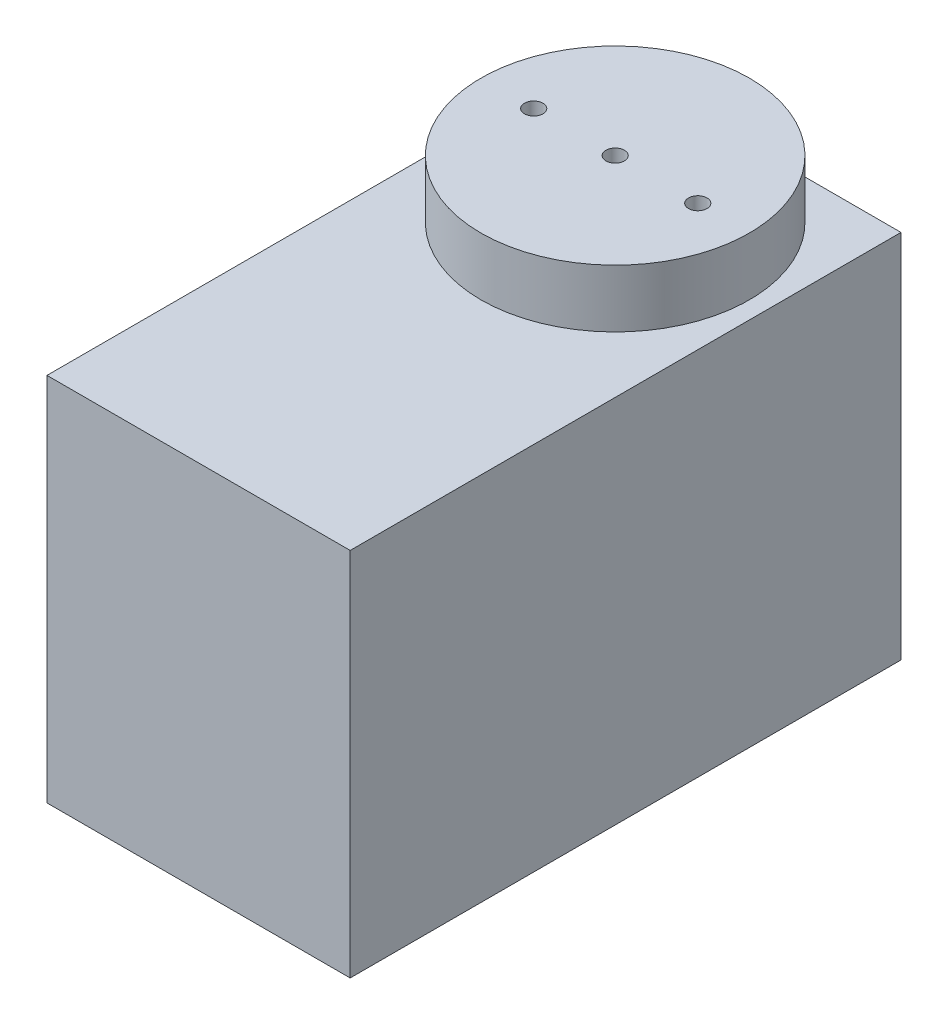
ISO-10303-21;
HEADER;
FILE_DESCRIPTION(('STEP AP214'),'2;1');
FILE_NAME('part.step','',(''),(''),'','','');
FILE_SCHEMA(('AUTOMOTIVE_DESIGN { 1 0 10303 214 1 1 1 1 }'));
ENDSEC;
DATA;
#1=APPLICATION_CONTEXT('core data for automotive mechanical design processes');
#2=APPLICATION_PROTOCOL_DEFINITION('international standard','automotive_design',2000,#1);
#3=PRODUCT_CONTEXT('',#1,'mechanical');
#4=PRODUCT('Part','Part','',(#3));
#5=PRODUCT_RELATED_PRODUCT_CATEGORY('part','',(#4));
#6=PRODUCT_DEFINITION_FORMATION('','',#4);
#7=PRODUCT_DEFINITION_CONTEXT('part definition',#1,'design');
#8=PRODUCT_DEFINITION('design','',#6,#7);
#9=PRODUCT_DEFINITION_SHAPE('','',#8);
#10=(LENGTH_UNIT() NAMED_UNIT(*) SI_UNIT(.MILLI.,.METRE.));
#11=(NAMED_UNIT(*) PLANE_ANGLE_UNIT() SI_UNIT($,.RADIAN.));
#12=(NAMED_UNIT(*) SI_UNIT($,.STERADIAN.) SOLID_ANGLE_UNIT());
#13=UNCERTAINTY_MEASURE_WITH_UNIT(LENGTH_MEASURE(1.E-05),#10,'distance_accuracy_value','');
#14=(GEOMETRIC_REPRESENTATION_CONTEXT(3) GLOBAL_UNCERTAINTY_ASSIGNED_CONTEXT((#13)) GLOBAL_UNIT_ASSIGNED_CONTEXT((#10,
#11,#12)) REPRESENTATION_CONTEXT('',''));
#15=CARTESIAN_POINT('',(0.,0.,0.));
#16=DIRECTION('',(0.,0.,1.));
#17=DIRECTION('',(1.,0.,0.));
#18=AXIS2_PLACEMENT_3D('',#15,#16,#17);
#19=CARTESIAN_POINT('',(13.1,32.,-23.8));
#20=DIRECTION('',(0.,-1.,0.));
#21=DIRECTION('',(0.,0.,-1.));
#22=AXIS2_PLACEMENT_3D('',#19,#20,#21);
#23=PLANE('',#22);
#24=DIRECTION('',(-1.,0.,0.));
#25=VECTOR('',#24,1.);
#26=CARTESIAN_POINT('',(-13.1,32.,-23.8));
#27=LINE('',#26,#25);
#28=CARTESIAN_POINT('',(13.1,32.,-23.8));
#29=VERTEX_POINT('',#28);
#30=CARTESIAN_POINT('',(0.,32.,-23.8));
#31=VERTEX_POINT('',#30);
#32=EDGE_CURVE('E85',#29,#31,#27,.T.);
#33=ORIENTED_EDGE('',*,*,#32,.T.);
#34=CARTESIAN_POINT('',(0.,32.,-12.2));
#35=DIRECTION('',(0.,1.,0.));
#36=DIRECTION('',(0.,0.,1.));
#37=AXIS2_PLACEMENT_3D('',#34,#35,#36);
#38=CIRCLE('',#37,11.6);
#39=EDGE_CURVE('E125',#31,#31,#38,.T.);
#40=ORIENTED_EDGE('',*,*,#39,.F.);
#41=CARTESIAN_POINT('',(-13.1,32.,-23.8));
#42=VERTEX_POINT('',#41);
#43=EDGE_CURVE('E134',#31,#42,#27,.T.);
#44=ORIENTED_EDGE('',*,*,#43,.T.);
#45=DIRECTION('',(0.,0.,1.));
#46=VECTOR('',#45,1.);
#47=CARTESIAN_POINT('',(-13.1,32.,23.8));
#48=LINE('',#47,#46);
#49=CARTESIAN_POINT('',(-13.1,32.,23.8));
#50=VERTEX_POINT('',#49);
#51=EDGE_CURVE('E136',#42,#50,#48,.T.);
#52=ORIENTED_EDGE('',*,*,#51,.T.);
#53=DIRECTION('',(1.,0.,0.));
#54=VECTOR('',#53,1.);
#55=CARTESIAN_POINT('',(-13.1,32.,23.8));
#56=LINE('',#55,#54);
#57=CARTESIAN_POINT('',(13.1,32.,23.8));
#58=VERTEX_POINT('',#57);
#59=EDGE_CURVE('E54',#50,#58,#56,.T.);
#60=ORIENTED_EDGE('',*,*,#59,.T.);
#61=DIRECTION('',(0.,0.,-1.));
#62=VECTOR('',#61,1.);
#63=CARTESIAN_POINT('',(13.1,32.,23.8));
#64=LINE('',#63,#62);
#65=EDGE_CURVE('E132',#58,#29,#64,.T.);
#66=ORIENTED_EDGE('',*,*,#65,.T.);
#67=EDGE_LOOP('',(#33,#40,#44,#52,#60,#66));
#68=FACE_BOUND('',#67,.T.);
#69=ADVANCED_FACE('F37',(#68),#23,.F.);
#70=CARTESIAN_POINT('',(13.1,32.,23.8));
#71=DIRECTION('',(-1.,0.,0.));
#72=DIRECTION('',(0.,0.,1.));
#73=AXIS2_PLACEMENT_3D('',#70,#71,#72);
#74=PLANE('',#73);
#75=DIRECTION('',(0.,0.,-1.));
#76=VECTOR('',#75,1.);
#77=CARTESIAN_POINT('',(13.1,0.,23.8));
#78=LINE('',#77,#76);
#79=CARTESIAN_POINT('',(13.1,0.,23.8));
#80=VERTEX_POINT('',#79);
#81=CARTESIAN_POINT('',(13.1,0.,-23.8));
#82=VERTEX_POINT('',#81);
#83=EDGE_CURVE('E129',#80,#82,#78,.T.);
#84=ORIENTED_EDGE('',*,*,#83,.T.);
#85=DIRECTION('',(0.,-1.,0.));
#86=VECTOR('',#85,1.);
#87=CARTESIAN_POINT('',(13.1,32.,-23.8));
#88=LINE('',#87,#86);
#89=EDGE_CURVE('E11',#29,#82,#88,.T.);
#90=ORIENTED_EDGE('',*,*,#89,.F.);
#91=ORIENTED_EDGE('',*,*,#65,.F.);
#92=DIRECTION('',(0.,-1.,0.));
#93=VECTOR('',#92,1.);
#94=CARTESIAN_POINT('',(13.1,32.,23.8));
#95=LINE('',#94,#93);
#96=EDGE_CURVE('E139',#58,#80,#95,.T.);
#97=ORIENTED_EDGE('',*,*,#96,.T.);
#98=EDGE_LOOP('',(#84,#90,#91,#97));
#99=FACE_BOUND('',#98,.T.);
#100=ADVANCED_FACE('F39',(#99),#74,.F.);
#101=CARTESIAN_POINT('',(-13.1,32.,-23.8));
#102=DIRECTION('',(0.,0.,1.));
#103=DIRECTION('',(1.,0.,0.));
#104=AXIS2_PLACEMENT_3D('',#101,#102,#103);
#105=PLANE('',#104);
#106=DIRECTION('',(-1.,0.,0.));
#107=VECTOR('',#106,1.);
#108=CARTESIAN_POINT('',(-13.1,0.,-23.8));
#109=LINE('',#108,#107);
#110=CARTESIAN_POINT('',(-13.1,0.,-23.8));
#111=VERTEX_POINT('',#110);
#112=EDGE_CURVE('E142',#82,#111,#109,.T.);
#113=ORIENTED_EDGE('',*,*,#112,.T.);
#114=DIRECTION('',(0.,-1.,0.));
#115=VECTOR('',#114,1.);
#116=CARTESIAN_POINT('',(-13.1,32.,-23.8));
#117=LINE('',#116,#115);
#118=EDGE_CURVE('E46',#42,#111,#117,.T.);
#119=ORIENTED_EDGE('',*,*,#118,.F.);
#120=ORIENTED_EDGE('',*,*,#43,.F.);
#121=ORIENTED_EDGE('',*,*,#32,.F.);
#122=ORIENTED_EDGE('',*,*,#89,.T.);
#123=EDGE_LOOP('',(#113,#119,#120,#121,#122));
#124=FACE_BOUND('',#123,.T.);
#125=ADVANCED_FACE('F166',(#124),#105,.F.);
#126=CARTESIAN_POINT('',(-13.1,32.,23.8));
#127=DIRECTION('',(1.,0.,0.));
#128=DIRECTION('',(0.,0.,-1.));
#129=AXIS2_PLACEMENT_3D('',#126,#127,#128);
#130=PLANE('',#129);
#131=DIRECTION('',(0.,0.,1.));
#132=VECTOR('',#131,1.);
#133=CARTESIAN_POINT('',(-13.1,0.,23.8));
#134=LINE('',#133,#132);
#135=CARTESIAN_POINT('',(-13.1,0.,23.8));
#136=VERTEX_POINT('',#135);
#137=EDGE_CURVE('E72',#111,#136,#134,.T.);
#138=ORIENTED_EDGE('',*,*,#137,.T.);
#139=DIRECTION('',(0.,-1.,0.));
#140=VECTOR('',#139,1.);
#141=CARTESIAN_POINT('',(-13.1,32.,23.8));
#142=LINE('',#141,#140);
#143=EDGE_CURVE('E147',#50,#136,#142,.T.);
#144=ORIENTED_EDGE('',*,*,#143,.F.);
#145=ORIENTED_EDGE('',*,*,#51,.F.);
#146=ORIENTED_EDGE('',*,*,#118,.T.);
#147=EDGE_LOOP('',(#138,#144,#145,#146));
#148=FACE_BOUND('',#147,.T.);
#149=ADVANCED_FACE('F150',(#148),#130,.F.);
#150=CARTESIAN_POINT('',(-13.1,32.,23.8));
#151=DIRECTION('',(0.,0.,-1.));
#152=DIRECTION('',(-1.,0.,0.));
#153=AXIS2_PLACEMENT_3D('',#150,#151,#152);
#154=PLANE('',#153);
#155=DIRECTION('',(1.,0.,0.));
#156=VECTOR('',#155,1.);
#157=CARTESIAN_POINT('',(-13.1,0.,23.8));
#158=LINE('',#157,#156);
#159=EDGE_CURVE('E78',#136,#80,#158,.T.);
#160=ORIENTED_EDGE('',*,*,#159,.T.);
#161=ORIENTED_EDGE('',*,*,#96,.F.);
#162=ORIENTED_EDGE('',*,*,#59,.F.);
#163=ORIENTED_EDGE('',*,*,#143,.T.);
#164=EDGE_LOOP('',(#160,#161,#162,#163));
#165=FACE_BOUND('',#164,.T.);
#166=ADVANCED_FACE('F157',(#165),#154,.F.);
#167=CARTESIAN_POINT('',(13.1,0.,-23.8));
#168=DIRECTION('',(0.,-1.,0.));
#169=DIRECTION('',(0.,0.,-1.));
#170=AXIS2_PLACEMENT_3D('',#167,#168,#169);
#171=PLANE('',#170);
#172=ORIENTED_EDGE('',*,*,#83,.F.);
#173=ORIENTED_EDGE('',*,*,#159,.F.);
#174=ORIENTED_EDGE('',*,*,#137,.F.);
#175=ORIENTED_EDGE('',*,*,#112,.F.);
#176=EDGE_LOOP('',(#172,#173,#174,#175));
#177=FACE_BOUND('',#176,.T.);
#178=ADVANCED_FACE('F153',(#177),#171,.T.);
#179=CARTESIAN_POINT('',(0.,37.,-12.2));
#180=DIRECTION('',(0.,-1.,0.));
#181=DIRECTION('',(0.,0.,-1.));
#182=AXIS2_PLACEMENT_3D('',#179,#180,#181);
#183=CYLINDRICAL_SURFACE('',#182,11.6);
#184=CARTESIAN_POINT('',(0.,37.,-12.2));
#185=DIRECTION('',(0.,1.,0.));
#186=DIRECTION('',(0.,0.,1.));
#187=AXIS2_PLACEMENT_3D('',#184,#185,#186);
#188=CIRCLE('',#187,11.6);
#189=CARTESIAN_POINT('',(0.,37.,-0.600000000000003));
#190=VERTEX_POINT('',#189);
#191=EDGE_CURVE('E126',#190,#190,#188,.T.);
#192=ORIENTED_EDGE('',*,*,#191,.F.);
#193=EDGE_LOOP('',(#192));
#194=FACE_BOUND('',#193,.T.);
#195=ORIENTED_EDGE('',*,*,#39,.T.);
#196=EDGE_LOOP('',(#195));
#197=FACE_BOUND('',#196,.T.);
#198=ADVANCED_FACE('F164',(#194,#197),#183,.T.);
#199=CARTESIAN_POINT('',(0.,37.,-12.2));
#200=DIRECTION('',(0.,1.,0.));
#201=DIRECTION('',(0.,0.,1.));
#202=AXIS2_PLACEMENT_3D('',#199,#200,#201);
#203=PLANE('',#202);
#204=CARTESIAN_POINT('',(0.,37.,-12.2));
#205=DIRECTION('',(0.,1.,0.));
#206=DIRECTION('',(0.,0.,1.));
#207=AXIS2_PLACEMENT_3D('',#204,#205,#206);
#208=CIRCLE('',#207,0.799999999999999);
#209=CARTESIAN_POINT('',(0.,37.,-11.4));
#210=VERTEX_POINT('',#209);
#211=EDGE_CURVE('E109',#210,#210,#208,.T.);
#212=ORIENTED_EDGE('',*,*,#211,.F.);
#213=EDGE_LOOP('',(#212));
#214=FACE_BOUND('',#213,.T.);
#215=CARTESIAN_POINT('',(-7.03985991945064,37.,-12.2));
#216=DIRECTION('',(0.,1.,0.));
#217=DIRECTION('',(0.,0.,1.));
#218=AXIS2_PLACEMENT_3D('',#215,#216,#217);
#219=CIRCLE('',#218,0.799999999999999);
#220=CARTESIAN_POINT('',(-7.03985991945064,37.,-11.4));
#221=VERTEX_POINT('',#220);
#222=EDGE_CURVE('E108',#221,#221,#219,.T.);
#223=ORIENTED_EDGE('',*,*,#222,.F.);
#224=EDGE_LOOP('',(#223));
#225=FACE_BOUND('',#224,.T.);
#226=CARTESIAN_POINT('',(7.13676792495085,37.,-12.2));
#227=DIRECTION('',(0.,1.,0.));
#228=DIRECTION('',(0.,0.,1.));
#229=AXIS2_PLACEMENT_3D('',#226,#227,#228);
#230=CIRCLE('',#229,0.799999999999999);
#231=CARTESIAN_POINT('',(7.13676792495085,37.,-11.4));
#232=VERTEX_POINT('',#231);
#233=EDGE_CURVE('E119',#232,#232,#230,.T.);
#234=ORIENTED_EDGE('',*,*,#233,.F.);
#235=EDGE_LOOP('',(#234));
#236=FACE_BOUND('',#235,.T.);
#237=ORIENTED_EDGE('',*,*,#191,.T.);
#238=EDGE_LOOP('',(#237));
#239=FACE_BOUND('',#238,.T.);
#240=ADVANCED_FACE('F176',(#214,#225,#236,#239),#203,.T.);
#241=CARTESIAN_POINT('',(7.13676792495085,31.8,-12.2));
#242=DIRECTION('',(0.,1.,0.));
#243=DIRECTION('',(0.,0.,1.));
#244=AXIS2_PLACEMENT_3D('',#241,#242,#243);
#245=CONICAL_SURFACE('',#244,0.799999999999999,1.02974425867666);
#246=CARTESIAN_POINT('',(7.13676792495085,31.319311504778,-12.2));
#247=VERTEX_POINT('',#246);
#248=VERTEX_LOOP('',#247);
#249=FACE_BOUND('',#248,.T.);
#250=CARTESIAN_POINT('',(7.13676792495085,31.8,-12.2));
#251=DIRECTION('',(0.,1.,0.));
#252=DIRECTION('',(0.,0.,1.));
#253=AXIS2_PLACEMENT_3D('',#250,#251,#252);
#254=CIRCLE('',#253,0.799999999999999);
#255=CARTESIAN_POINT('',(7.13676792495085,31.8,-11.4));
#256=VERTEX_POINT('',#255);
#257=EDGE_CURVE('E122',#256,#256,#254,.T.);
#258=ORIENTED_EDGE('',*,*,#257,.T.);
#259=EDGE_LOOP('',(#258));
#260=FACE_BOUND('',#259,.T.);
#261=ADVANCED_FACE('F180',(#249,#260),#245,.F.);
#262=CARTESIAN_POINT('',(7.13676792495085,37.,-12.2));
#263=DIRECTION('',(0.,1.,0.));
#264=DIRECTION('',(0.,0.,1.));
#265=AXIS2_PLACEMENT_3D('',#262,#263,#264);
#266=CYLINDRICAL_SURFACE('',#265,0.799999999999999);
#267=ORIENTED_EDGE('',*,*,#257,.F.);
#268=EDGE_LOOP('',(#267));
#269=FACE_BOUND('',#268,.T.);
#270=ORIENTED_EDGE('',*,*,#233,.T.);
#271=EDGE_LOOP('',(#270));
#272=FACE_BOUND('',#271,.T.);
#273=ADVANCED_FACE('F184',(#269,#272),#266,.F.);
#274=CARTESIAN_POINT('',(-7.03985991945064,31.8,-12.2));
#275=DIRECTION('',(0.,1.,0.));
#276=DIRECTION('',(0.,0.,1.));
#277=AXIS2_PLACEMENT_3D('',#274,#275,#276);
#278=CONICAL_SURFACE('',#277,0.799999999999999,1.02974425867666);
#279=CARTESIAN_POINT('',(-7.03985991945064,31.319311504778,-12.2));
#280=VERTEX_POINT('',#279);
#281=VERTEX_LOOP('',#280);
#282=FACE_BOUND('',#281,.T.);
#283=CARTESIAN_POINT('',(-7.03985991945064,31.8,-12.2));
#284=DIRECTION('',(0.,1.,0.));
#285=DIRECTION('',(0.,0.,1.));
#286=AXIS2_PLACEMENT_3D('',#283,#284,#285);
#287=CIRCLE('',#286,0.799999999999999);
#288=CARTESIAN_POINT('',(-7.03985991945064,31.8,-11.4));
#289=VERTEX_POINT('',#288);
#290=EDGE_CURVE('E112',#289,#289,#287,.T.);
#291=ORIENTED_EDGE('',*,*,#290,.T.);
#292=EDGE_LOOP('',(#291));
#293=FACE_BOUND('',#292,.T.);
#294=ADVANCED_FACE('F188',(#282,#293),#278,.F.);
#295=CARTESIAN_POINT('',(-7.03985991945064,37.,-12.2));
#296=DIRECTION('',(0.,1.,0.));
#297=DIRECTION('',(0.,0.,1.));
#298=AXIS2_PLACEMENT_3D('',#295,#296,#297);
#299=CYLINDRICAL_SURFACE('',#298,0.799999999999999);
#300=ORIENTED_EDGE('',*,*,#290,.F.);
#301=EDGE_LOOP('',(#300));
#302=FACE_BOUND('',#301,.T.);
#303=ORIENTED_EDGE('',*,*,#222,.T.);
#304=EDGE_LOOP('',(#303));
#305=FACE_BOUND('',#304,.T.);
#306=ADVANCED_FACE('F102',(#302,#305),#299,.F.);
#307=CARTESIAN_POINT('',(0.,31.8,-12.2));
#308=DIRECTION('',(0.,1.,0.));
#309=DIRECTION('',(0.,0.,1.));
#310=AXIS2_PLACEMENT_3D('',#307,#308,#309);
#311=CONICAL_SURFACE('',#310,0.799999999999999,1.02974425867666);
#312=CARTESIAN_POINT('',(0.,31.319311504778,-12.2));
#313=VERTEX_POINT('',#312);
#314=VERTEX_LOOP('',#313);
#315=FACE_BOUND('',#314,.T.);
#316=CARTESIAN_POINT('',(0.,31.8,-12.2));
#317=DIRECTION('',(0.,1.,0.));
#318=DIRECTION('',(0.,0.,1.));
#319=AXIS2_PLACEMENT_3D('',#316,#317,#318);
#320=CIRCLE('',#319,0.799999999999999);
#321=CARTESIAN_POINT('',(0.,31.8,-11.4));
#322=VERTEX_POINT('',#321);
#323=EDGE_CURVE('E106',#322,#322,#320,.T.);
#324=ORIENTED_EDGE('',*,*,#323,.T.);
#325=EDGE_LOOP('',(#324));
#326=FACE_BOUND('',#325,.T.);
#327=ADVANCED_FACE('F98',(#315,#326),#311,.F.);
#328=CARTESIAN_POINT('',(0.,37.,-12.2));
#329=DIRECTION('',(0.,1.,0.));
#330=DIRECTION('',(0.,0.,1.));
#331=AXIS2_PLACEMENT_3D('',#328,#329,#330);
#332=CYLINDRICAL_SURFACE('',#331,0.799999999999999);
#333=ORIENTED_EDGE('',*,*,#323,.F.);
#334=EDGE_LOOP('',(#333));
#335=FACE_BOUND('',#334,.T.);
#336=ORIENTED_EDGE('',*,*,#211,.T.);
#337=EDGE_LOOP('',(#336));
#338=FACE_BOUND('',#337,.T.);
#339=ADVANCED_FACE('F101',(#335,#338),#332,.F.);
#340=CLOSED_SHELL('',(#69,#100,#125,#149,#166,#178,#198,#240,#261,#273,#294,#306,#327,#339));
#341=MANIFOLD_SOLID_BREP('B2',#340);
#342=ADVANCED_BREP_SHAPE_REPRESENTATION('',(#18,#341),#14);
#343=SHAPE_DEFINITION_REPRESENTATION(#9,#342);
ENDSEC;
END-ISO-10303-21;
